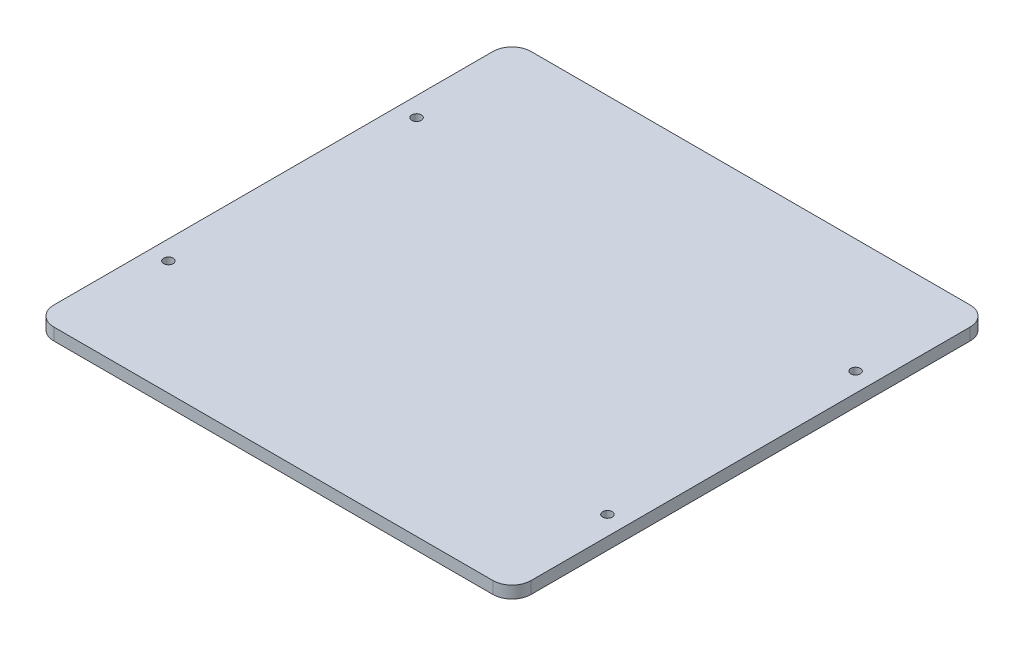
ISO-10303-21;
HEADER;
FILE_DESCRIPTION(('STEP AP214'),'2;1');
FILE_NAME('part.step','',(''),(''),'','','');
FILE_SCHEMA(('AUTOMOTIVE_DESIGN { 1 0 10303 214 1 1 1 1 }'));
ENDSEC;
DATA;
#1=APPLICATION_CONTEXT('core data for automotive mechanical design processes');
#2=APPLICATION_PROTOCOL_DEFINITION('international standard','automotive_design',2000,#1);
#3=PRODUCT_CONTEXT('',#1,'mechanical');
#4=PRODUCT('Part','Part','',(#3));
#5=PRODUCT_RELATED_PRODUCT_CATEGORY('part','',(#4));
#6=PRODUCT_DEFINITION_FORMATION('','',#4);
#7=PRODUCT_DEFINITION_CONTEXT('part definition',#1,'design');
#8=PRODUCT_DEFINITION('design','',#6,#7);
#9=PRODUCT_DEFINITION_SHAPE('','',#8);
#10=(LENGTH_UNIT() NAMED_UNIT(*) SI_UNIT(.MILLI.,.METRE.));
#11=(NAMED_UNIT(*) PLANE_ANGLE_UNIT() SI_UNIT($,.RADIAN.));
#12=(NAMED_UNIT(*) SI_UNIT($,.STERADIAN.) SOLID_ANGLE_UNIT());
#13=UNCERTAINTY_MEASURE_WITH_UNIT(LENGTH_MEASURE(1.E-05),#10,'distance_accuracy_value','');
#14=(GEOMETRIC_REPRESENTATION_CONTEXT(3) GLOBAL_UNCERTAINTY_ASSIGNED_CONTEXT((#13)) GLOBAL_UNIT_ASSIGNED_CONTEXT((#10,
#11,#12)) REPRESENTATION_CONTEXT('',''));
#15=CARTESIAN_POINT('',(0.,0.,0.));
#16=DIRECTION('',(0.,0.,1.));
#17=DIRECTION('',(1.,0.,0.));
#18=AXIS2_PLACEMENT_3D('',#15,#16,#17);
#19=CARTESIAN_POINT('',(-125.,6.35,-125.));
#20=DIRECTION('',(1.,0.,0.));
#21=DIRECTION('',(0.,0.,-1.));
#22=AXIS2_PLACEMENT_3D('',#19,#20,#21);
#23=PLANE('',#22);
#24=DIRECTION('',(0.,0.,1.));
#25=VECTOR('',#24,1.);
#26=CARTESIAN_POINT('',(-125.,6.35,-125.));
#27=LINE('',#26,#25);
#28=CARTESIAN_POINT('',(-125.,6.35,-115.));
#29=VERTEX_POINT('',#28);
#30=CARTESIAN_POINT('',(-125.,6.35,115.));
#31=VERTEX_POINT('',#30);
#32=EDGE_CURVE('E120',#29,#31,#27,.T.);
#33=ORIENTED_EDGE('',*,*,#32,.F.);
#34=DIRECTION('',(0.,-1.,0.));
#35=VECTOR('',#34,1.);
#36=CARTESIAN_POINT('',(-125.,6.35,-115.));
#37=LINE('',#36,#35);
#38=CARTESIAN_POINT('',(-125.,0.,-115.));
#39=VERTEX_POINT('',#38);
#40=EDGE_CURVE('E105',#29,#39,#37,.T.);
#41=ORIENTED_EDGE('',*,*,#40,.T.);
#42=DIRECTION('',(0.,0.,1.));
#43=VECTOR('',#42,1.);
#44=CARTESIAN_POINT('',(-125.,0.,-125.));
#45=LINE('',#44,#43);
#46=CARTESIAN_POINT('',(-125.,0.,115.));
#47=VERTEX_POINT('',#46);
#48=EDGE_CURVE('E117',#39,#47,#45,.T.);
#49=ORIENTED_EDGE('',*,*,#48,.T.);
#50=DIRECTION('',(0.,-1.,0.));
#51=VECTOR('',#50,1.);
#52=CARTESIAN_POINT('',(-125.,6.35,115.));
#53=LINE('',#52,#51);
#54=EDGE_CURVE('E122',#47,#31,#53,.F.);
#55=ORIENTED_EDGE('',*,*,#54,.T.);
#56=EDGE_LOOP('',(#33,#41,#49,#55));
#57=FACE_BOUND('',#56,.T.);
#58=ADVANCED_FACE('F35',(#57),#23,.F.);
#59=CARTESIAN_POINT('',(-125.,6.35,125.));
#60=DIRECTION('',(0.,0.,-1.));
#61=DIRECTION('',(-1.,0.,0.));
#62=AXIS2_PLACEMENT_3D('',#59,#60,#61);
#63=PLANE('',#62);
#64=DIRECTION('',(1.,0.,0.));
#65=VECTOR('',#64,1.);
#66=CARTESIAN_POINT('',(-125.,0.,125.));
#67=LINE('',#66,#65);
#68=CARTESIAN_POINT('',(-115.,0.,125.));
#69=VERTEX_POINT('',#68);
#70=CARTESIAN_POINT('',(115.,0.,125.));
#71=VERTEX_POINT('',#70);
#72=EDGE_CURVE('E126',#69,#71,#67,.T.);
#73=ORIENTED_EDGE('',*,*,#72,.T.);
#74=DIRECTION('',(0.,-1.,0.));
#75=VECTOR('',#74,1.);
#76=CARTESIAN_POINT('',(115.,6.35,125.));
#77=LINE('',#76,#75);
#78=CARTESIAN_POINT('',(115.,6.35,125.));
#79=VERTEX_POINT('',#78);
#80=EDGE_CURVE('E11',#71,#79,#77,.F.);
#81=ORIENTED_EDGE('',*,*,#80,.T.);
#82=DIRECTION('',(1.,0.,0.));
#83=VECTOR('',#82,1.);
#84=CARTESIAN_POINT('',(-125.,6.35,125.));
#85=LINE('',#84,#83);
#86=CARTESIAN_POINT('',(-115.,6.35,125.));
#87=VERTEX_POINT('',#86);
#88=EDGE_CURVE('E166',#87,#79,#85,.T.);
#89=ORIENTED_EDGE('',*,*,#88,.F.);
#90=DIRECTION('',(0.,-1.,0.));
#91=VECTOR('',#90,1.);
#92=CARTESIAN_POINT('',(-115.,6.35,125.));
#93=LINE('',#92,#91);
#94=EDGE_CURVE('E43',#87,#69,#93,.T.);
#95=ORIENTED_EDGE('',*,*,#94,.T.);
#96=EDGE_LOOP('',(#73,#81,#89,#95));
#97=FACE_BOUND('',#96,.T.);
#98=ADVANCED_FACE('F164',(#97),#63,.F.);
#99=CARTESIAN_POINT('',(125.,6.35,-125.));
#100=DIRECTION('',(-1.,0.,0.));
#101=DIRECTION('',(0.,0.,1.));
#102=AXIS2_PLACEMENT_3D('',#99,#100,#101);
#103=PLANE('',#102);
#104=DIRECTION('',(0.,0.,-1.));
#105=VECTOR('',#104,1.);
#106=CARTESIAN_POINT('',(125.,0.,-125.));
#107=LINE('',#106,#105);
#108=CARTESIAN_POINT('',(125.,0.,115.));
#109=VERTEX_POINT('',#108);
#110=CARTESIAN_POINT('',(125.,0.,-115.));
#111=VERTEX_POINT('',#110);
#112=EDGE_CURVE('E130',#109,#111,#107,.T.);
#113=ORIENTED_EDGE('',*,*,#112,.T.);
#114=DIRECTION('',(0.,-1.,0.));
#115=VECTOR('',#114,1.);
#116=CARTESIAN_POINT('',(125.,6.35,-115.));
#117=LINE('',#116,#115);
#118=CARTESIAN_POINT('',(125.,6.35,-115.));
#119=VERTEX_POINT('',#118);
#120=EDGE_CURVE('E50',#111,#119,#117,.F.);
#121=ORIENTED_EDGE('',*,*,#120,.T.);
#122=DIRECTION('',(0.,0.,-1.));
#123=VECTOR('',#122,1.);
#124=CARTESIAN_POINT('',(125.,6.35,-125.));
#125=LINE('',#124,#123);
#126=CARTESIAN_POINT('',(125.,6.35,115.));
#127=VERTEX_POINT('',#126);
#128=EDGE_CURVE('E174',#127,#119,#125,.T.);
#129=ORIENTED_EDGE('',*,*,#128,.F.);
#130=DIRECTION('',(0.,-1.,0.));
#131=VECTOR('',#130,1.);
#132=CARTESIAN_POINT('',(125.,6.35,115.));
#133=LINE('',#132,#131);
#134=EDGE_CURVE('E157',#127,#109,#133,.T.);
#135=ORIENTED_EDGE('',*,*,#134,.T.);
#136=EDGE_LOOP('',(#113,#121,#129,#135));
#137=FACE_BOUND('',#136,.T.);
#138=ADVANCED_FACE('F173',(#137),#103,.F.);
#139=CARTESIAN_POINT('',(-125.,6.35,-125.));
#140=DIRECTION('',(0.,0.,1.));
#141=DIRECTION('',(1.,0.,0.));
#142=AXIS2_PLACEMENT_3D('',#139,#140,#141);
#143=PLANE('',#142);
#144=DIRECTION('',(-1.,0.,0.));
#145=VECTOR('',#144,1.);
#146=CARTESIAN_POINT('',(-125.,0.,-125.));
#147=LINE('',#146,#145);
#148=CARTESIAN_POINT('',(115.,0.,-125.));
#149=VERTEX_POINT('',#148);
#150=CARTESIAN_POINT('',(-115.,0.,-125.));
#151=VERTEX_POINT('',#150);
#152=EDGE_CURVE('E140',#149,#151,#147,.T.);
#153=ORIENTED_EDGE('',*,*,#152,.T.);
#154=DIRECTION('',(0.,-1.,0.));
#155=VECTOR('',#154,1.);
#156=CARTESIAN_POINT('',(-115.,6.35,-125.));
#157=LINE('',#156,#155);
#158=CARTESIAN_POINT('',(-115.,6.35,-125.));
#159=VERTEX_POINT('',#158);
#160=EDGE_CURVE('E106',#151,#159,#157,.F.);
#161=ORIENTED_EDGE('',*,*,#160,.T.);
#162=DIRECTION('',(-1.,0.,0.));
#163=VECTOR('',#162,1.);
#164=CARTESIAN_POINT('',(-125.,6.35,-125.));
#165=LINE('',#164,#163);
#166=CARTESIAN_POINT('',(115.,6.35,-125.));
#167=VERTEX_POINT('',#166);
#168=EDGE_CURVE('E136',#167,#159,#165,.T.);
#169=ORIENTED_EDGE('',*,*,#168,.F.);
#170=DIRECTION('',(0.,-1.,0.));
#171=VECTOR('',#170,1.);
#172=CARTESIAN_POINT('',(115.,6.35,-125.));
#173=LINE('',#172,#171);
#174=EDGE_CURVE('E111',#167,#149,#173,.T.);
#175=ORIENTED_EDGE('',*,*,#174,.T.);
#176=EDGE_LOOP('',(#153,#161,#169,#175));
#177=FACE_BOUND('',#176,.T.);
#178=ADVANCED_FACE('F214',(#177),#143,.F.);
#179=CARTESIAN_POINT('',(0.,6.35,0.));
#180=DIRECTION('',(0.,1.,0.));
#181=DIRECTION('',(0.,0.,1.));
#182=AXIS2_PLACEMENT_3D('',#179,#180,#181);
#183=PLANE('',#182);
#184=CARTESIAN_POINT('',(-115.,6.35,65.));
#185=DIRECTION('',(0.,1.,0.));
#186=DIRECTION('',(0.,0.,1.));
#187=AXIS2_PLACEMENT_3D('',#184,#185,#186);
#188=CIRCLE('',#187,2.50000000000001);
#189=CARTESIAN_POINT('',(-115.,6.35,67.5));
#190=VERTEX_POINT('',#189);
#191=EDGE_CURVE('E183',#190,#190,#188,.T.);
#192=ORIENTED_EDGE('',*,*,#191,.F.);
#193=EDGE_LOOP('',(#192));
#194=FACE_BOUND('',#193,.T.);
#195=CARTESIAN_POINT('',(115.,6.35,65.));
#196=DIRECTION('',(0.,1.,0.));
#197=DIRECTION('',(0.,0.,1.));
#198=AXIS2_PLACEMENT_3D('',#195,#196,#197);
#199=CIRCLE('',#198,2.50000000000001);
#200=CARTESIAN_POINT('',(115.,6.35,67.5));
#201=VERTEX_POINT('',#200);
#202=EDGE_CURVE('E189',#201,#201,#199,.T.);
#203=ORIENTED_EDGE('',*,*,#202,.F.);
#204=EDGE_LOOP('',(#203));
#205=FACE_BOUND('',#204,.T.);
#206=CARTESIAN_POINT('',(115.,6.35,-65.));
#207=DIRECTION('',(0.,1.,0.));
#208=DIRECTION('',(0.,0.,1.));
#209=AXIS2_PLACEMENT_3D('',#206,#207,#208);
#210=CIRCLE('',#209,2.50000000000001);
#211=CARTESIAN_POINT('',(115.,6.35,-62.5));
#212=VERTEX_POINT('',#211);
#213=EDGE_CURVE('E195',#212,#212,#210,.T.);
#214=ORIENTED_EDGE('',*,*,#213,.F.);
#215=EDGE_LOOP('',(#214));
#216=FACE_BOUND('',#215,.T.);
#217=CARTESIAN_POINT('',(-115.,6.35,-65.));
#218=DIRECTION('',(0.,1.,0.));
#219=DIRECTION('',(0.,0.,1.));
#220=AXIS2_PLACEMENT_3D('',#217,#218,#219);
#221=CIRCLE('',#220,2.5);
#222=CARTESIAN_POINT('',(-115.,6.35,-62.5));
#223=VERTEX_POINT('',#222);
#224=EDGE_CURVE('E133',#223,#223,#221,.T.);
#225=ORIENTED_EDGE('',*,*,#224,.F.);
#226=EDGE_LOOP('',(#225));
#227=FACE_BOUND('',#226,.T.);
#228=ORIENTED_EDGE('',*,*,#168,.T.);
#229=CARTESIAN_POINT('',(-115.,6.35,-115.));
#230=DIRECTION('',(0.,1.,0.));
#231=DIRECTION('',(0.,0.,1.));
#232=AXIS2_PLACEMENT_3D('',#229,#230,#231);
#233=CIRCLE('',#232,10.);
#234=EDGE_CURVE('E155',#159,#29,#233,.T.);
#235=ORIENTED_EDGE('',*,*,#234,.T.);
#236=ORIENTED_EDGE('',*,*,#32,.T.);
#237=CARTESIAN_POINT('',(-115.,6.35,115.));
#238=DIRECTION('',(0.,1.,0.));
#239=DIRECTION('',(0.,0.,1.));
#240=AXIS2_PLACEMENT_3D('',#237,#238,#239);
#241=CIRCLE('',#240,10.);
#242=EDGE_CURVE('E150',#31,#87,#241,.T.);
#243=ORIENTED_EDGE('',*,*,#242,.T.);
#244=ORIENTED_EDGE('',*,*,#88,.T.);
#245=CARTESIAN_POINT('',(115.,6.35,115.));
#246=DIRECTION('',(0.,1.,0.));
#247=DIRECTION('',(0.,0.,1.));
#248=AXIS2_PLACEMENT_3D('',#245,#246,#247);
#249=CIRCLE('',#248,10.);
#250=EDGE_CURVE('E57',#79,#127,#249,.T.);
#251=ORIENTED_EDGE('',*,*,#250,.T.);
#252=ORIENTED_EDGE('',*,*,#128,.T.);
#253=CARTESIAN_POINT('',(115.,6.35,-115.));
#254=DIRECTION('',(0.,1.,0.));
#255=DIRECTION('',(0.,0.,1.));
#256=AXIS2_PLACEMENT_3D('',#253,#254,#255);
#257=CIRCLE('',#256,10.);
#258=EDGE_CURVE('E153',#119,#167,#257,.T.);
#259=ORIENTED_EDGE('',*,*,#258,.T.);
#260=EDGE_LOOP('',(#228,#235,#236,#243,#244,#251,#252,#259));
#261=FACE_BOUND('',#260,.T.);
#262=ADVANCED_FACE('F211',(#194,#205,#216,#227,#261),#183,.T.);
#263=CARTESIAN_POINT('',(0.,0.,0.));
#264=DIRECTION('',(0.,1.,0.));
#265=DIRECTION('',(0.,0.,1.));
#266=AXIS2_PLACEMENT_3D('',#263,#264,#265);
#267=PLANE('',#266);
#268=CARTESIAN_POINT('',(-115.,0.,65.));
#269=DIRECTION('',(0.,1.,0.));
#270=DIRECTION('',(0.,0.,1.));
#271=AXIS2_PLACEMENT_3D('',#268,#269,#270);
#272=CIRCLE('',#271,2.50000000000001);
#273=CARTESIAN_POINT('',(-115.,0.,67.5));
#274=VERTEX_POINT('',#273);
#275=EDGE_CURVE('E186',#274,#274,#272,.T.);
#276=ORIENTED_EDGE('',*,*,#275,.T.);
#277=EDGE_LOOP('',(#276));
#278=FACE_BOUND('',#277,.T.);
#279=CARTESIAN_POINT('',(115.,0.,65.));
#280=DIRECTION('',(0.,1.,0.));
#281=DIRECTION('',(0.,0.,1.));
#282=AXIS2_PLACEMENT_3D('',#279,#280,#281);
#283=CIRCLE('',#282,2.50000000000001);
#284=CARTESIAN_POINT('',(115.,0.,67.5));
#285=VERTEX_POINT('',#284);
#286=EDGE_CURVE('E192',#285,#285,#283,.T.);
#287=ORIENTED_EDGE('',*,*,#286,.T.);
#288=EDGE_LOOP('',(#287));
#289=FACE_BOUND('',#288,.T.);
#290=CARTESIAN_POINT('',(115.,0.,-65.));
#291=DIRECTION('',(0.,1.,0.));
#292=DIRECTION('',(0.,0.,1.));
#293=AXIS2_PLACEMENT_3D('',#290,#291,#292);
#294=CIRCLE('',#293,2.50000000000001);
#295=CARTESIAN_POINT('',(115.,0.,-62.5));
#296=VERTEX_POINT('',#295);
#297=EDGE_CURVE('E181',#296,#296,#294,.T.);
#298=ORIENTED_EDGE('',*,*,#297,.T.);
#299=EDGE_LOOP('',(#298));
#300=FACE_BOUND('',#299,.T.);
#301=CARTESIAN_POINT('',(-115.,0.,-65.));
#302=DIRECTION('',(0.,1.,0.));
#303=DIRECTION('',(0.,0.,1.));
#304=AXIS2_PLACEMENT_3D('',#301,#302,#303);
#305=CIRCLE('',#304,2.5);
#306=CARTESIAN_POINT('',(-115.,0.,-62.5));
#307=VERTEX_POINT('',#306);
#308=EDGE_CURVE('E127',#307,#307,#305,.T.);
#309=ORIENTED_EDGE('',*,*,#308,.T.);
#310=EDGE_LOOP('',(#309));
#311=FACE_BOUND('',#310,.T.);
#312=ORIENTED_EDGE('',*,*,#48,.F.);
#313=CARTESIAN_POINT('',(-115.,0.,-115.));
#314=DIRECTION('',(0.,1.,0.));
#315=DIRECTION('',(0.,0.,1.));
#316=AXIS2_PLACEMENT_3D('',#313,#314,#315);
#317=CIRCLE('',#316,10.);
#318=EDGE_CURVE('E101',#39,#151,#317,.F.);
#319=ORIENTED_EDGE('',*,*,#318,.T.);
#320=ORIENTED_EDGE('',*,*,#152,.F.);
#321=CARTESIAN_POINT('',(115.,0.,-115.));
#322=DIRECTION('',(0.,1.,0.));
#323=DIRECTION('',(0.,0.,1.));
#324=AXIS2_PLACEMENT_3D('',#321,#322,#323);
#325=CIRCLE('',#324,10.);
#326=EDGE_CURVE('E112',#149,#111,#325,.F.);
#327=ORIENTED_EDGE('',*,*,#326,.T.);
#328=ORIENTED_EDGE('',*,*,#112,.F.);
#329=CARTESIAN_POINT('',(115.,0.,115.));
#330=DIRECTION('',(0.,1.,0.));
#331=DIRECTION('',(0.,0.,1.));
#332=AXIS2_PLACEMENT_3D('',#329,#330,#331);
#333=CIRCLE('',#332,10.);
#334=EDGE_CURVE('E144',#109,#71,#333,.F.);
#335=ORIENTED_EDGE('',*,*,#334,.T.);
#336=ORIENTED_EDGE('',*,*,#72,.F.);
#337=CARTESIAN_POINT('',(-115.,0.,115.));
#338=DIRECTION('',(0.,1.,0.));
#339=DIRECTION('',(0.,0.,1.));
#340=AXIS2_PLACEMENT_3D('',#337,#338,#339);
#341=CIRCLE('',#340,10.);
#342=EDGE_CURVE('E121',#69,#47,#341,.F.);
#343=ORIENTED_EDGE('',*,*,#342,.T.);
#344=EDGE_LOOP('',(#312,#319,#320,#327,#328,#335,#336,#343));
#345=FACE_BOUND('',#344,.T.);
#346=ADVANCED_FACE('F124',(#278,#289,#300,#311,#345),#267,.F.);
#347=CARTESIAN_POINT('',(-115.,0.,-65.));
#348=DIRECTION('',(0.,1.,0.));
#349=DIRECTION('',(0.,0.,1.));
#350=AXIS2_PLACEMENT_3D('',#347,#348,#349);
#351=CYLINDRICAL_SURFACE('',#350,2.5);
#352=ORIENTED_EDGE('',*,*,#308,.F.);
#353=EDGE_LOOP('',(#352));
#354=FACE_BOUND('',#353,.T.);
#355=ORIENTED_EDGE('',*,*,#224,.T.);
#356=EDGE_LOOP('',(#355));
#357=FACE_BOUND('',#356,.T.);
#358=ADVANCED_FACE('F207',(#354,#357),#351,.F.);
#359=CARTESIAN_POINT('',(115.,0.,-65.));
#360=DIRECTION('',(0.,1.,0.));
#361=DIRECTION('',(0.,0.,1.));
#362=AXIS2_PLACEMENT_3D('',#359,#360,#361);
#363=CYLINDRICAL_SURFACE('',#362,2.50000000000001);
#364=ORIENTED_EDGE('',*,*,#297,.F.);
#365=EDGE_LOOP('',(#364));
#366=FACE_BOUND('',#365,.T.);
#367=ORIENTED_EDGE('',*,*,#213,.T.);
#368=EDGE_LOOP('',(#367));
#369=FACE_BOUND('',#368,.T.);
#370=ADVANCED_FACE('F203',(#366,#369),#363,.F.);
#371=CARTESIAN_POINT('',(115.,0.,65.));
#372=DIRECTION('',(0.,1.,0.));
#373=DIRECTION('',(0.,0.,1.));
#374=AXIS2_PLACEMENT_3D('',#371,#372,#373);
#375=CYLINDRICAL_SURFACE('',#374,2.50000000000001);
#376=ORIENTED_EDGE('',*,*,#286,.F.);
#377=EDGE_LOOP('',(#376));
#378=FACE_BOUND('',#377,.T.);
#379=ORIENTED_EDGE('',*,*,#202,.T.);
#380=EDGE_LOOP('',(#379));
#381=FACE_BOUND('',#380,.T.);
#382=ADVANCED_FACE('F206',(#378,#381),#375,.F.);
#383=CARTESIAN_POINT('',(-115.,0.,65.));
#384=DIRECTION('',(0.,1.,0.));
#385=DIRECTION('',(0.,0.,1.));
#386=AXIS2_PLACEMENT_3D('',#383,#384,#385);
#387=CYLINDRICAL_SURFACE('',#386,2.50000000000001);
#388=ORIENTED_EDGE('',*,*,#275,.F.);
#389=EDGE_LOOP('',(#388));
#390=FACE_BOUND('',#389,.T.);
#391=ORIENTED_EDGE('',*,*,#191,.T.);
#392=EDGE_LOOP('',(#391));
#393=FACE_BOUND('',#392,.T.);
#394=ADVANCED_FACE('F229',(#390,#393),#387,.F.);
#395=CARTESIAN_POINT('',(-115.,6.35,-115.));
#396=DIRECTION('',(0.,-1.,0.));
#397=DIRECTION('',(0.,0.,-1.));
#398=AXIS2_PLACEMENT_3D('',#395,#396,#397);
#399=CYLINDRICAL_SURFACE('',#398,10.);
#400=ORIENTED_EDGE('',*,*,#234,.F.);
#401=ORIENTED_EDGE('',*,*,#160,.F.);
#402=ORIENTED_EDGE('',*,*,#318,.F.);
#403=ORIENTED_EDGE('',*,*,#40,.F.);
#404=EDGE_LOOP('',(#400,#401,#402,#403));
#405=FACE_BOUND('',#404,.T.);
#406=ADVANCED_FACE('F104',(#405),#399,.T.);
#407=CARTESIAN_POINT('',(115.,6.35,-115.));
#408=DIRECTION('',(0.,-1.,0.));
#409=DIRECTION('',(0.,0.,-1.));
#410=AXIS2_PLACEMENT_3D('',#407,#408,#409);
#411=CYLINDRICAL_SURFACE('',#410,10.);
#412=ORIENTED_EDGE('',*,*,#258,.F.);
#413=ORIENTED_EDGE('',*,*,#120,.F.);
#414=ORIENTED_EDGE('',*,*,#326,.F.);
#415=ORIENTED_EDGE('',*,*,#174,.F.);
#416=EDGE_LOOP('',(#412,#413,#414,#415));
#417=FACE_BOUND('',#416,.T.);
#418=ADVANCED_FACE('F222',(#417),#411,.T.);
#419=CARTESIAN_POINT('',(115.,6.35,115.));
#420=DIRECTION('',(0.,-1.,0.));
#421=DIRECTION('',(0.,0.,-1.));
#422=AXIS2_PLACEMENT_3D('',#419,#420,#421);
#423=CYLINDRICAL_SURFACE('',#422,10.);
#424=ORIENTED_EDGE('',*,*,#250,.F.);
#425=ORIENTED_EDGE('',*,*,#80,.F.);
#426=ORIENTED_EDGE('',*,*,#334,.F.);
#427=ORIENTED_EDGE('',*,*,#134,.F.);
#428=EDGE_LOOP('',(#424,#425,#426,#427));
#429=FACE_BOUND('',#428,.T.);
#430=ADVANCED_FACE('F172',(#429),#423,.T.);
#431=CARTESIAN_POINT('',(-115.,6.35,115.));
#432=DIRECTION('',(0.,-1.,0.));
#433=DIRECTION('',(0.,0.,-1.));
#434=AXIS2_PLACEMENT_3D('',#431,#432,#433);
#435=CYLINDRICAL_SURFACE('',#434,10.);
#436=ORIENTED_EDGE('',*,*,#242,.F.);
#437=ORIENTED_EDGE('',*,*,#54,.F.);
#438=ORIENTED_EDGE('',*,*,#342,.F.);
#439=ORIENTED_EDGE('',*,*,#94,.F.);
#440=EDGE_LOOP('',(#436,#437,#438,#439));
#441=FACE_BOUND('',#440,.T.);
#442=ADVANCED_FACE('F37',(#441),#435,.T.);
#443=CLOSED_SHELL('',(#58,#98,#138,#178,#262,#346,#358,#370,#382,#394,#406,#418,#430,#442));
#444=MANIFOLD_SOLID_BREP('B2',#443);
#445=ADVANCED_BREP_SHAPE_REPRESENTATION('',(#18,#444),#14);
#446=SHAPE_DEFINITION_REPRESENTATION(#9,#445);
ENDSEC;
END-ISO-10303-21;
